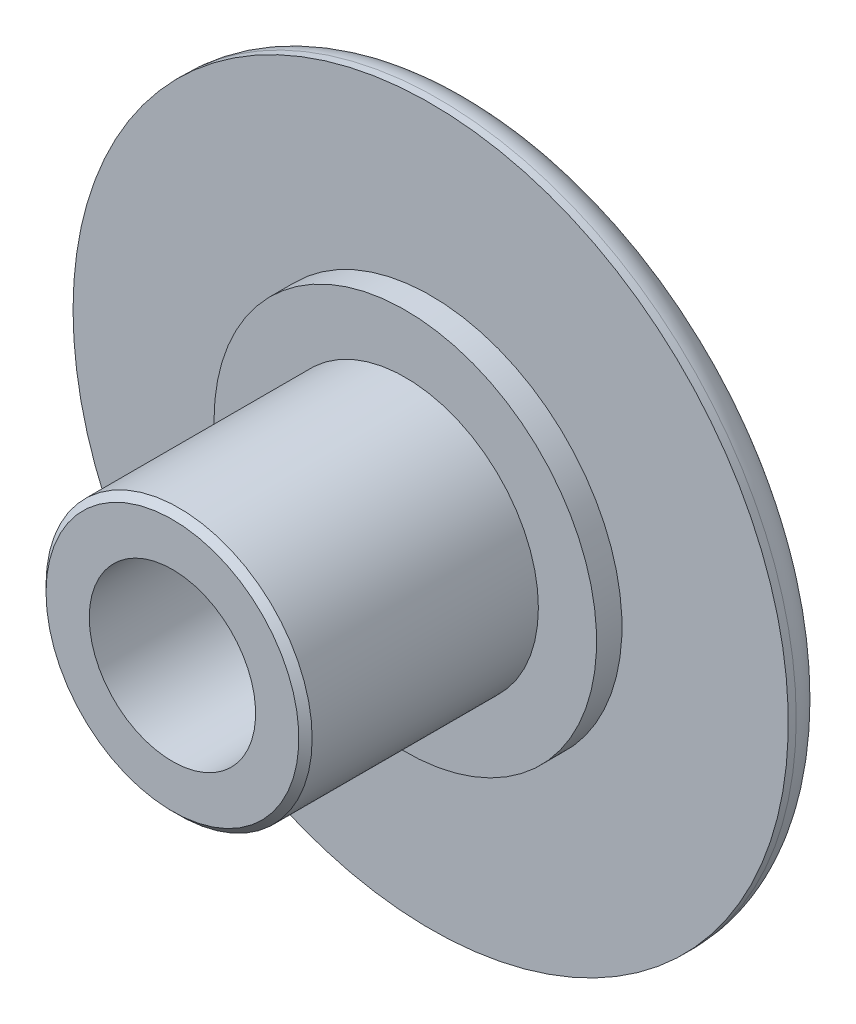
ISO-10303-21;
HEADER;
FILE_DESCRIPTION(('STEP AP214'),'2;1');
FILE_NAME('part.step','',(''),(''),'','','');
FILE_SCHEMA(('AUTOMOTIVE_DESIGN { 1 0 10303 214 1 1 1 1 }'));
ENDSEC;
DATA;
#1=APPLICATION_CONTEXT('core data for automotive mechanical design processes');
#2=APPLICATION_PROTOCOL_DEFINITION('international standard','automotive_design',2000,#1);
#3=PRODUCT_CONTEXT('',#1,'mechanical');
#4=PRODUCT('Part','Part','',(#3));
#5=PRODUCT_RELATED_PRODUCT_CATEGORY('part','',(#4));
#6=PRODUCT_DEFINITION_FORMATION('','',#4);
#7=PRODUCT_DEFINITION_CONTEXT('part definition',#1,'design');
#8=PRODUCT_DEFINITION('design','',#6,#7);
#9=PRODUCT_DEFINITION_SHAPE('','',#8);
#10=(LENGTH_UNIT() NAMED_UNIT(*) SI_UNIT(.MILLI.,.METRE.));
#11=(NAMED_UNIT(*) PLANE_ANGLE_UNIT() SI_UNIT($,.RADIAN.));
#12=(NAMED_UNIT(*) SI_UNIT($,.STERADIAN.) SOLID_ANGLE_UNIT());
#13=UNCERTAINTY_MEASURE_WITH_UNIT(LENGTH_MEASURE(1.E-05),#10,'distance_accuracy_value','');
#14=(GEOMETRIC_REPRESENTATION_CONTEXT(3) GLOBAL_UNCERTAINTY_ASSIGNED_CONTEXT((#13)) GLOBAL_UNIT_ASSIGNED_CONTEXT((#10,
#11,#12)) REPRESENTATION_CONTEXT('',''));
#15=CARTESIAN_POINT('',(0.,0.,0.));
#16=DIRECTION('',(0.,0.,1.));
#17=DIRECTION('',(1.,0.,0.));
#18=AXIS2_PLACEMENT_3D('',#15,#16,#17);
#19=CARTESIAN_POINT('',(0.,0.,-9.86592858439089));
#20=DIRECTION('',(0.,0.,-1.));
#21=DIRECTION('',(-1.,0.,0.));
#22=AXIS2_PLACEMENT_3D('',#19,#20,#21);
#23=CYLINDRICAL_SURFACE('',#22,4.);
#24=CARTESIAN_POINT('',(0.,0.,-0.200000000000002));
#25=DIRECTION('',(0.,0.,-1.));
#26=DIRECTION('',(-1.,0.,0.));
#27=AXIS2_PLACEMENT_3D('',#24,#25,#26);
#28=CIRCLE('',#27,4.);
#29=CARTESIAN_POINT('',(-4.,0.,-0.200000000000002));
#30=VERTEX_POINT('',#29);
#31=EDGE_CURVE('E55',#30,#30,#28,.T.);
#32=ORIENTED_EDGE('',*,*,#31,.T.);
#33=EDGE_LOOP('',(#32));
#34=FACE_BOUND('',#33,.T.);
#35=CARTESIAN_POINT('',(0.,0.,-7.));
#36=DIRECTION('',(0.,0.,-1.));
#37=DIRECTION('',(-1.,0.,0.));
#38=AXIS2_PLACEMENT_3D('',#35,#36,#37);
#39=CIRCLE('',#38,4.);
#40=CARTESIAN_POINT('',(-4.,0.,-7.));
#41=VERTEX_POINT('',#40);
#42=EDGE_CURVE('E81',#41,#41,#39,.T.);
#43=ORIENTED_EDGE('',*,*,#42,.F.);
#44=EDGE_LOOP('',(#43));
#45=FACE_BOUND('',#44,.T.);
#46=ADVANCED_FACE('F37',(#34,#45),#23,.T.);
#47=CARTESIAN_POINT('',(4.,0.,0.));
#48=DIRECTION('',(0.,0.,-1.));
#49=DIRECTION('',(-1.,0.,0.));
#50=AXIS2_PLACEMENT_3D('',#47,#48,#49);
#51=PLANE('',#50);
#52=CARTESIAN_POINT('',(0.,0.,0.));
#53=DIRECTION('',(0.,0.,-1.));
#54=DIRECTION('',(-1.,0.,0.));
#55=AXIS2_PLACEMENT_3D('',#52,#53,#54);
#56=CIRCLE('',#55,3.8);
#57=CARTESIAN_POINT('',(-3.8,0.,0.));
#58=VERTEX_POINT('',#57);
#59=EDGE_CURVE('E50',#58,#58,#56,.F.);
#60=ORIENTED_EDGE('',*,*,#59,.T.);
#61=EDGE_LOOP('',(#60));
#62=FACE_BOUND('',#61,.T.);
#63=CARTESIAN_POINT('',(0.,0.,0.));
#64=DIRECTION('',(0.,0.,-1.));
#65=DIRECTION('',(-1.,0.,0.));
#66=AXIS2_PLACEMENT_3D('',#63,#64,#65);
#67=CIRCLE('',#66,2.5);
#68=CARTESIAN_POINT('',(-2.5,0.,0.));
#69=VERTEX_POINT('',#68);
#70=EDGE_CURVE('E61',#69,#69,#67,.T.);
#71=ORIENTED_EDGE('',*,*,#70,.T.);
#72=EDGE_LOOP('',(#71));
#73=FACE_BOUND('',#72,.T.);
#74=ADVANCED_FACE('F89',(#62,#73),#51,.F.);
#75=CARTESIAN_POINT('',(0.,0.,-9.86592858439089));
#76=DIRECTION('',(0.,0.,-1.));
#77=DIRECTION('',(-1.,0.,0.));
#78=AXIS2_PLACEMENT_3D('',#75,#76,#77);
#79=CYLINDRICAL_SURFACE('',#78,2.5);
#80=ORIENTED_EDGE('',*,*,#70,.F.);
#81=EDGE_LOOP('',(#80));
#82=FACE_BOUND('',#81,.T.);
#83=CARTESIAN_POINT('',(0.,0.,-6.));
#84=DIRECTION('',(0.,0.,-1.));
#85=DIRECTION('',(-1.,0.,0.));
#86=AXIS2_PLACEMENT_3D('',#83,#84,#85);
#87=CIRCLE('',#86,2.5);
#88=CARTESIAN_POINT('',(-2.5,0.,-6.));
#89=VERTEX_POINT('',#88);
#90=EDGE_CURVE('E65',#89,#89,#87,.T.);
#91=ORIENTED_EDGE('',*,*,#90,.T.);
#92=EDGE_LOOP('',(#91));
#93=FACE_BOUND('',#92,.T.);
#94=ADVANCED_FACE('F95',(#82,#93),#79,.F.);
#95=CARTESIAN_POINT('',(2.5,0.,-6.));
#96=DIRECTION('',(0.,0.,-1.));
#97=DIRECTION('',(-1.,0.,0.));
#98=AXIS2_PLACEMENT_3D('',#95,#96,#97);
#99=PLANE('',#98);
#100=ORIENTED_EDGE('',*,*,#90,.F.);
#101=EDGE_LOOP('',(#100));
#102=FACE_BOUND('',#101,.T.);
#103=ADVANCED_FACE('F118',(#102),#99,.F.);
#104=CARTESIAN_POINT('',(0.,0.,-9.));
#105=DIRECTION('',(0.,0.,1.));
#106=DIRECTION('',(1.,0.,0.));
#107=AXIS2_PLACEMENT_3D('',#104,#105,#106);
#108=PLANE('',#107);
#109=CARTESIAN_POINT('',(0.,0.,-9.));
#110=DIRECTION('',(0.,0.,1.));
#111=DIRECTION('',(1.,0.,0.));
#112=AXIS2_PLACEMENT_3D('',#109,#110,#111);
#113=CIRCLE('',#112,9.75);
#114=CARTESIAN_POINT('',(9.75,0.,-9.));
#115=VERTEX_POINT('',#114);
#116=EDGE_CURVE('E45',#115,#115,#113,.F.);
#117=ORIENTED_EDGE('',*,*,#116,.T.);
#118=EDGE_LOOP('',(#117));
#119=FACE_BOUND('',#118,.T.);
#120=ADVANCED_FACE('F122',(#119),#108,.F.);
#121=CARTESIAN_POINT('',(0.,0.,-9.86592858439089));
#122=DIRECTION('',(0.,0.,-1.));
#123=DIRECTION('',(-1.,0.,0.));
#124=AXIS2_PLACEMENT_3D('',#121,#122,#123);
#125=CYLINDRICAL_SURFACE('',#124,10.75);
#126=CARTESIAN_POINT('',(0.,0.,-8.));
#127=DIRECTION('',(0.,0.,1.));
#128=DIRECTION('',(1.,0.,0.));
#129=AXIS2_PLACEMENT_3D('',#126,#127,#128);
#130=CIRCLE('',#129,10.75);
#131=CARTESIAN_POINT('',(10.75,0.,-8.));
#132=VERTEX_POINT('',#131);
#133=EDGE_CURVE('E10',#132,#132,#130,.T.);
#134=ORIENTED_EDGE('',*,*,#133,.T.);
#135=EDGE_LOOP('',(#134));
#136=FACE_BOUND('',#135,.T.);
#137=CARTESIAN_POINT('',(0.,0.,-7.76224520545698));
#138=DIRECTION('',(0.,0.,-1.));
#139=DIRECTION('',(-1.,0.,0.));
#140=AXIS2_PLACEMENT_3D('',#137,#138,#139);
#141=CIRCLE('',#140,10.75);
#142=CARTESIAN_POINT('',(-10.75,0.,-7.76224520545698));
#143=VERTEX_POINT('',#142);
#144=EDGE_CURVE('E69',#143,#143,#141,.T.);
#145=ORIENTED_EDGE('',*,*,#144,.T.);
#146=EDGE_LOOP('',(#145));
#147=FACE_BOUND('',#146,.T.);
#148=ADVANCED_FACE('F127',(#136,#147),#125,.T.);
#149=CARTESIAN_POINT('',(10.75,0.,-7.76224520545698));
#150=DIRECTION('',(0.,0.,-1.));
#151=DIRECTION('',(-1.,0.,0.));
#152=AXIS2_PLACEMENT_3D('',#149,#150,#151);
#153=PLANE('',#152);
#154=ORIENTED_EDGE('',*,*,#144,.F.);
#155=EDGE_LOOP('',(#154));
#156=FACE_BOUND('',#155,.T.);
#157=CARTESIAN_POINT('',(0.,0.,-7.76224520545698));
#158=DIRECTION('',(0.,0.,-1.));
#159=DIRECTION('',(-1.,0.,0.));
#160=AXIS2_PLACEMENT_3D('',#157,#158,#159);
#161=CIRCLE('',#160,5.75);
#162=CARTESIAN_POINT('',(-5.75,0.,-7.76224520545698));
#163=VERTEX_POINT('',#162);
#164=EDGE_CURVE('E73',#163,#163,#161,.T.);
#165=ORIENTED_EDGE('',*,*,#164,.T.);
#166=EDGE_LOOP('',(#165));
#167=FACE_BOUND('',#166,.T.);
#168=ADVANCED_FACE('F132',(#156,#167),#153,.F.);
#169=CARTESIAN_POINT('',(0.,0.,-9.86592858439089));
#170=DIRECTION('',(0.,0.,-1.));
#171=DIRECTION('',(-1.,0.,0.));
#172=AXIS2_PLACEMENT_3D('',#169,#170,#171);
#173=CYLINDRICAL_SURFACE('',#172,5.75);
#174=ORIENTED_EDGE('',*,*,#164,.F.);
#175=EDGE_LOOP('',(#174));
#176=FACE_BOUND('',#175,.T.);
#177=CARTESIAN_POINT('',(0.,0.,-7.));
#178=DIRECTION('',(0.,0.,-1.));
#179=DIRECTION('',(-1.,0.,0.));
#180=AXIS2_PLACEMENT_3D('',#177,#178,#179);
#181=CIRCLE('',#180,5.75);
#182=CARTESIAN_POINT('',(-5.75,0.,-7.));
#183=VERTEX_POINT('',#182);
#184=EDGE_CURVE('E77',#183,#183,#181,.T.);
#185=ORIENTED_EDGE('',*,*,#184,.T.);
#186=EDGE_LOOP('',(#185));
#187=FACE_BOUND('',#186,.T.);
#188=ADVANCED_FACE('F107',(#176,#187),#173,.T.);
#189=CARTESIAN_POINT('',(5.75,0.,-7.));
#190=DIRECTION('',(0.,0.,-1.));
#191=DIRECTION('',(-1.,0.,0.));
#192=AXIS2_PLACEMENT_3D('',#189,#190,#191);
#193=PLANE('',#192);
#194=ORIENTED_EDGE('',*,*,#184,.F.);
#195=EDGE_LOOP('',(#194));
#196=FACE_BOUND('',#195,.T.);
#197=ORIENTED_EDGE('',*,*,#42,.T.);
#198=EDGE_LOOP('',(#197));
#199=FACE_BOUND('',#198,.T.);
#200=ADVANCED_FACE('F86',(#196,#199),#193,.F.);
#201=CARTESIAN_POINT('',(0.,0.,-0.200000000000002));
#202=DIRECTION('',(0.,0.,-1.));
#203=DIRECTION('',(-1.,0.,0.));
#204=AXIS2_PLACEMENT_3D('',#201,#202,#203);
#205=CONICAL_SURFACE('',#204,4.,0.78539816339744);
#206=ORIENTED_EDGE('',*,*,#59,.F.);
#207=EDGE_LOOP('',(#206));
#208=FACE_BOUND('',#207,.T.);
#209=ORIENTED_EDGE('',*,*,#31,.F.);
#210=EDGE_LOOP('',(#209));
#211=FACE_BOUND('',#210,.T.);
#212=ADVANCED_FACE('F99',(#208,#211),#205,.T.);
#213=CARTESIAN_POINT('',(0.,0.,-8.));
#214=DIRECTION('',(0.,0.,1.));
#215=DIRECTION('',(1.,0.,0.));
#216=AXIS2_PLACEMENT_3D('',#213,#214,#215);
#217=TOROIDAL_SURFACE('',#216,9.75,1.);
#218=ORIENTED_EDGE('',*,*,#133,.F.);
#219=EDGE_LOOP('',(#218));
#220=FACE_BOUND('',#219,.T.);
#221=ORIENTED_EDGE('',*,*,#116,.F.);
#222=EDGE_LOOP('',(#221));
#223=FACE_BOUND('',#222,.T.);
#224=ADVANCED_FACE('F39',(#220,#223),#217,.T.);
#225=CLOSED_SHELL('',(#46,#74,#94,#103,#120,#148,#168,#188,#200,#212,#224));
#226=MANIFOLD_SOLID_BREP('B2',#225);
#227=ADVANCED_BREP_SHAPE_REPRESENTATION('',(#18,#226),#14);
#228=SHAPE_DEFINITION_REPRESENTATION(#9,#227);
ENDSEC;
END-ISO-10303-21;
